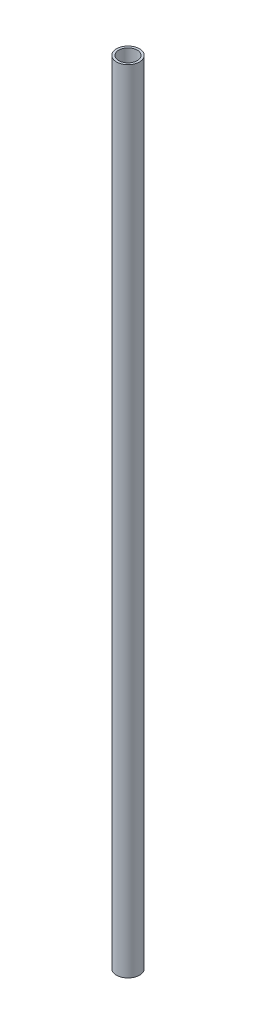
ISO-10303-21;
HEADER;
FILE_DESCRIPTION(('STEP AP214'),'2;1');
FILE_NAME('part.step','',(''),(''),'','','');
FILE_SCHEMA(('AUTOMOTIVE_DESIGN { 1 0 10303 214 1 1 1 1 }'));
ENDSEC;
DATA;
#1=APPLICATION_CONTEXT('core data for automotive mechanical design processes');
#2=APPLICATION_PROTOCOL_DEFINITION('international standard','automotive_design',2000,#1);
#3=PRODUCT_CONTEXT('',#1,'mechanical');
#4=PRODUCT('Part','Part','',(#3));
#5=PRODUCT_RELATED_PRODUCT_CATEGORY('part','',(#4));
#6=PRODUCT_DEFINITION_FORMATION('','',#4);
#7=PRODUCT_DEFINITION_CONTEXT('part definition',#1,'design');
#8=PRODUCT_DEFINITION('design','',#6,#7);
#9=PRODUCT_DEFINITION_SHAPE('','',#8);
#10=(LENGTH_UNIT() NAMED_UNIT(*) SI_UNIT(.MILLI.,.METRE.));
#11=(NAMED_UNIT(*) PLANE_ANGLE_UNIT() SI_UNIT($,.RADIAN.));
#12=(NAMED_UNIT(*) SI_UNIT($,.STERADIAN.) SOLID_ANGLE_UNIT());
#13=UNCERTAINTY_MEASURE_WITH_UNIT(LENGTH_MEASURE(1.E-05),#10,'distance_accuracy_value','');
#14=(GEOMETRIC_REPRESENTATION_CONTEXT(3) GLOBAL_UNCERTAINTY_ASSIGNED_CONTEXT((#13)) GLOBAL_UNIT_ASSIGNED_CONTEXT((#10,
#11,#12)) REPRESENTATION_CONTEXT('',''));
#15=CARTESIAN_POINT('',(0.,0.,0.));
#16=DIRECTION('',(0.,0.,1.));
#17=DIRECTION('',(1.,0.,0.));
#18=AXIS2_PLACEMENT_3D('',#15,#16,#17);
#19=CARTESIAN_POINT('',(0.,438.15,0.));
#20=DIRECTION('',(0.,1.,0.));
#21=DIRECTION('',(0.,0.,1.));
#22=AXIS2_PLACEMENT_3D('',#19,#20,#21);
#23=PLANE('',#22);
#24=CARTESIAN_POINT('',(0.,438.15,0.));
#25=DIRECTION('',(0.,1.,0.));
#26=DIRECTION('',(0.,0.,1.));
#27=AXIS2_PLACEMENT_3D('',#24,#25,#26);
#28=CIRCLE('',#27,6.35);
#29=CARTESIAN_POINT('',(0.,438.15,6.35));
#30=VERTEX_POINT('',#29);
#31=EDGE_CURVE('E10',#30,#30,#28,.T.);
#32=ORIENTED_EDGE('',*,*,#31,.T.);
#33=EDGE_LOOP('',(#32));
#34=FACE_BOUND('',#33,.T.);
#35=CARTESIAN_POINT('',(0.,438.15,0.));
#36=DIRECTION('',(0.,1.,0.));
#37=DIRECTION('',(0.,0.,1.));
#38=AXIS2_PLACEMENT_3D('',#35,#36,#37);
#39=CIRCLE('',#38,5.1054);
#40=CARTESIAN_POINT('',(0.,438.15,5.1054));
#41=VERTEX_POINT('',#40);
#42=EDGE_CURVE('E50',#41,#41,#39,.T.);
#43=ORIENTED_EDGE('',*,*,#42,.F.);
#44=EDGE_LOOP('',(#43));
#45=FACE_BOUND('',#44,.T.);
#46=ADVANCED_FACE('F39',(#34,#45),#23,.T.);
#47=CARTESIAN_POINT('',(0.,0.,0.));
#48=DIRECTION('',(0.,1.,0.));
#49=DIRECTION('',(0.,0.,1.));
#50=AXIS2_PLACEMENT_3D('',#47,#48,#49);
#51=PLANE('',#50);
#52=CARTESIAN_POINT('',(0.,0.,0.));
#53=DIRECTION('',(0.,1.,0.));
#54=DIRECTION('',(0.,0.,1.));
#55=AXIS2_PLACEMENT_3D('',#52,#53,#54);
#56=CIRCLE('',#55,6.35);
#57=CARTESIAN_POINT('',(0.,0.,6.35));
#58=VERTEX_POINT('',#57);
#59=EDGE_CURVE('E43',#58,#58,#56,.T.);
#60=ORIENTED_EDGE('',*,*,#59,.F.);
#61=EDGE_LOOP('',(#60));
#62=FACE_BOUND('',#61,.T.);
#63=CARTESIAN_POINT('',(0.,0.,0.));
#64=DIRECTION('',(0.,1.,0.));
#65=DIRECTION('',(0.,0.,1.));
#66=AXIS2_PLACEMENT_3D('',#63,#64,#65);
#67=CIRCLE('',#66,5.1054);
#68=CARTESIAN_POINT('',(0.,0.,5.1054));
#69=VERTEX_POINT('',#68);
#70=EDGE_CURVE('E52',#69,#69,#67,.T.);
#71=ORIENTED_EDGE('',*,*,#70,.T.);
#72=EDGE_LOOP('',(#71));
#73=FACE_BOUND('',#72,.T.);
#74=ADVANCED_FACE('F62',(#62,#73),#51,.F.);
#75=CARTESIAN_POINT('',(0.,438.15,0.));
#76=DIRECTION('',(0.,-1.,0.));
#77=DIRECTION('',(0.,0.,-1.));
#78=AXIS2_PLACEMENT_3D('',#75,#76,#77);
#79=CYLINDRICAL_SURFACE('',#78,6.35);
#80=ORIENTED_EDGE('',*,*,#31,.F.);
#81=EDGE_LOOP('',(#80));
#82=FACE_BOUND('',#81,.T.);
#83=ORIENTED_EDGE('',*,*,#59,.T.);
#84=EDGE_LOOP('',(#83));
#85=FACE_BOUND('',#84,.T.);
#86=ADVANCED_FACE('F41',(#82,#85),#79,.T.);
#87=CARTESIAN_POINT('',(0.,438.15,0.));
#88=DIRECTION('',(0.,-1.,0.));
#89=DIRECTION('',(0.,0.,-1.));
#90=AXIS2_PLACEMENT_3D('',#87,#88,#89);
#91=CYLINDRICAL_SURFACE('',#90,5.1054);
#92=ORIENTED_EDGE('',*,*,#42,.T.);
#93=EDGE_LOOP('',(#92));
#94=FACE_BOUND('',#93,.T.);
#95=ORIENTED_EDGE('',*,*,#70,.F.);
#96=EDGE_LOOP('',(#95));
#97=FACE_BOUND('',#96,.T.);
#98=ADVANCED_FACE('F58',(#94,#97),#91,.F.);
#99=CLOSED_SHELL('',(#46,#74,#86,#98));
#100=MANIFOLD_SOLID_BREP('B2',#99);
#101=ADVANCED_BREP_SHAPE_REPRESENTATION('',(#18,#100),#14);
#102=SHAPE_DEFINITION_REPRESENTATION(#9,#101);
ENDSEC;
END-ISO-10303-21;
